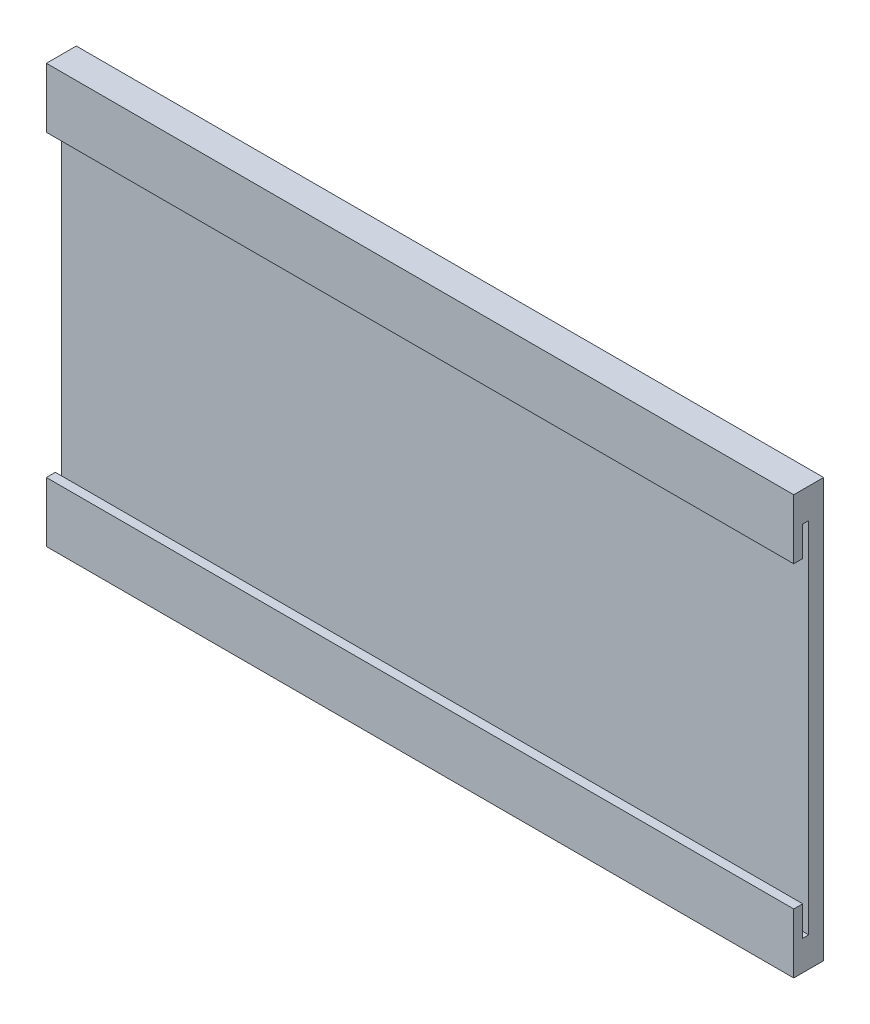
ISO-10303-21;
HEADER;
FILE_DESCRIPTION(('STEP AP214'),'2;1');
FILE_NAME('part.step','',(''),(''),'','','');
FILE_SCHEMA(('AUTOMOTIVE_DESIGN { 1 0 10303 214 1 1 1 1 }'));
ENDSEC;
DATA;
#1=APPLICATION_CONTEXT('core data for automotive mechanical design processes');
#2=APPLICATION_PROTOCOL_DEFINITION('international standard','automotive_design',2000,#1);
#3=PRODUCT_CONTEXT('',#1,'mechanical');
#4=PRODUCT('Part','Part','',(#3));
#5=PRODUCT_RELATED_PRODUCT_CATEGORY('part','',(#4));
#6=PRODUCT_DEFINITION_FORMATION('','',#4);
#7=PRODUCT_DEFINITION_CONTEXT('part definition',#1,'design');
#8=PRODUCT_DEFINITION('design','',#6,#7);
#9=PRODUCT_DEFINITION_SHAPE('','',#8);
#10=(LENGTH_UNIT() NAMED_UNIT(*) SI_UNIT(.MILLI.,.METRE.));
#11=(NAMED_UNIT(*) PLANE_ANGLE_UNIT() SI_UNIT($,.RADIAN.));
#12=(NAMED_UNIT(*) SI_UNIT($,.STERADIAN.) SOLID_ANGLE_UNIT());
#13=UNCERTAINTY_MEASURE_WITH_UNIT(LENGTH_MEASURE(1.E-05),#10,'distance_accuracy_value','');
#14=(GEOMETRIC_REPRESENTATION_CONTEXT(3) GLOBAL_UNCERTAINTY_ASSIGNED_CONTEXT((#13)) GLOBAL_UNIT_ASSIGNED_CONTEXT((#10,
#11,#12)) REPRESENTATION_CONTEXT('',''));
#15=CARTESIAN_POINT('',(0.,0.,0.));
#16=DIRECTION('',(0.,0.,1.));
#17=DIRECTION('',(1.,0.,0.));
#18=AXIS2_PLACEMENT_3D('',#15,#16,#17);
#19=CARTESIAN_POINT('',(0.,0.,5.));
#20=DIRECTION('',(0.,0.,1.));
#21=DIRECTION('',(1.,0.,0.));
#22=AXIS2_PLACEMENT_3D('',#19,#20,#21);
#23=PLANE('',#22);
#24=DIRECTION('',(0.,-1.,0.));
#25=VECTOR('',#24,1.);
#26=CARTESIAN_POINT('',(250.,0.,5.));
#27=LINE('',#26,#25);
#28=CARTESIAN_POINT('',(250.,-50.,5.));
#29=VERTEX_POINT('',#28);
#30=CARTESIAN_POINT('',(250.,-70.,5.));
#31=VERTEX_POINT('',#30);
#32=EDGE_CURVE('E270',#29,#31,#27,.T.);
#33=ORIENTED_EDGE('',*,*,#32,.F.);
#34=DIRECTION('',(1.,0.,0.));
#35=VECTOR('',#34,1.);
#36=CARTESIAN_POINT('',(0.,-50.,5.));
#37=LINE('',#36,#35);
#38=CARTESIAN_POINT('',(0.,-50.,5.));
#39=VERTEX_POINT('',#38);
#40=EDGE_CURVE('E284',#39,#29,#37,.T.);
#41=ORIENTED_EDGE('',*,*,#40,.F.);
#42=DIRECTION('',(0.,-1.,0.));
#43=VECTOR('',#42,1.);
#44=CARTESIAN_POINT('',(0.,0.,5.));
#45=LINE('',#44,#43);
#46=CARTESIAN_POINT('',(0.,-70.,5.));
#47=VERTEX_POINT('',#46);
#48=EDGE_CURVE('E264',#39,#47,#45,.T.);
#49=ORIENTED_EDGE('',*,*,#48,.T.);
#50=DIRECTION('',(1.,0.,0.));
#51=VECTOR('',#50,1.);
#52=CARTESIAN_POINT('',(0.,-70.,5.));
#53=LINE('',#52,#51);
#54=EDGE_CURVE('E267',#47,#31,#53,.T.);
#55=ORIENTED_EDGE('',*,*,#54,.T.);
#56=EDGE_LOOP('',(#33,#41,#49,#55));
#57=FACE_BOUND('',#56,.T.);
#58=ADVANCED_FACE('F131',(#57),#23,.T.);
#59=DIRECTION('',(1.,0.,0.));
#60=VECTOR('',#59,1.);
#61=CARTESIAN_POINT('',(0.,50.,5.));
#62=LINE('',#61,#60);
#63=CARTESIAN_POINT('',(0.,50.,5.));
#64=VERTEX_POINT('',#63);
#65=CARTESIAN_POINT('',(250.,50.,5.));
#66=VERTEX_POINT('',#65);
#67=EDGE_CURVE('E243',#64,#66,#62,.T.);
#68=ORIENTED_EDGE('',*,*,#67,.T.);
#69=CARTESIAN_POINT('',(250.,70.,5.));
#70=VERTEX_POINT('',#69);
#71=EDGE_CURVE('E271',#70,#66,#27,.T.);
#72=ORIENTED_EDGE('',*,*,#71,.F.);
#73=DIRECTION('',(1.,0.,0.));
#74=VECTOR('',#73,1.);
#75=CARTESIAN_POINT('',(0.,70.,5.));
#76=LINE('',#75,#74);
#77=CARTESIAN_POINT('',(0.,70.,5.));
#78=VERTEX_POINT('',#77);
#79=EDGE_CURVE('E255',#78,#70,#76,.T.);
#80=ORIENTED_EDGE('',*,*,#79,.F.);
#81=EDGE_CURVE('E265',#78,#64,#45,.T.);
#82=ORIENTED_EDGE('',*,*,#81,.T.);
#83=EDGE_LOOP('',(#68,#72,#80,#82));
#84=FACE_BOUND('',#83,.T.);
#85=ADVANCED_FACE('F335',(#84),#23,.T.);
#86=CARTESIAN_POINT('',(0.,70.,5.));
#87=DIRECTION('',(0.,1.,0.));
#88=DIRECTION('',(-1.,0.,0.));
#89=AXIS2_PLACEMENT_3D('',#86,#87,#88);
#90=PLANE('',#89);
#91=DIRECTION('',(0.,0.,-1.));
#92=VECTOR('',#91,1.);
#93=CARTESIAN_POINT('',(250.,70.,5.));
#94=LINE('',#93,#92);
#95=CARTESIAN_POINT('',(250.,70.,-5.));
#96=VERTEX_POINT('',#95);
#97=EDGE_CURVE('E261',#70,#96,#94,.T.);
#98=ORIENTED_EDGE('',*,*,#97,.T.);
#99=DIRECTION('',(1.,0.,0.));
#100=VECTOR('',#99,1.);
#101=CARTESIAN_POINT('',(0.,70.,-5.));
#102=LINE('',#101,#100);
#103=CARTESIAN_POINT('',(0.,70.,-5.));
#104=VERTEX_POINT('',#103);
#105=EDGE_CURVE('E247',#104,#96,#102,.T.);
#106=ORIENTED_EDGE('',*,*,#105,.F.);
#107=DIRECTION('',(0.,0.,-1.));
#108=VECTOR('',#107,1.);
#109=CARTESIAN_POINT('',(0.,70.,5.));
#110=LINE('',#109,#108);
#111=EDGE_CURVE('E258',#78,#104,#110,.T.);
#112=ORIENTED_EDGE('',*,*,#111,.F.);
#113=ORIENTED_EDGE('',*,*,#79,.T.);
#114=EDGE_LOOP('',(#98,#106,#112,#113));
#115=FACE_BOUND('',#114,.T.);
#116=ADVANCED_FACE('F340',(#115),#90,.T.);
#117=CARTESIAN_POINT('',(250.,0.,-5.));
#118=DIRECTION('',(-1.,0.,0.));
#119=DIRECTION('',(0.,0.,1.));
#120=AXIS2_PLACEMENT_3D('',#117,#118,#119);
#121=PLANE('',#120);
#122=DIRECTION('',(0.,0.,-1.));
#123=VECTOR('',#122,1.);
#124=CARTESIAN_POINT('',(250.,50.,5.));
#125=LINE('',#124,#123);
#126=CARTESIAN_POINT('',(250.,50.,2.));
#127=VERTEX_POINT('',#126);
#128=EDGE_CURVE('E244',#66,#127,#125,.T.);
#129=ORIENTED_EDGE('',*,*,#128,.T.);
#130=DIRECTION('',(0.,-1.,0.));
#131=VECTOR('',#130,1.);
#132=CARTESIAN_POINT('',(250.,0.,2.));
#133=LINE('',#132,#131);
#134=CARTESIAN_POINT('',(250.,60.,2.));
#135=VERTEX_POINT('',#134);
#136=EDGE_CURVE('E227',#135,#127,#133,.T.);
#137=ORIENTED_EDGE('',*,*,#136,.F.);
#138=DIRECTION('',(0.,0.,-1.));
#139=VECTOR('',#138,1.);
#140=CARTESIAN_POINT('',(250.,60.,2.));
#141=LINE('',#140,#139);
#142=CARTESIAN_POINT('',(250.,60.,0.));
#143=VERTEX_POINT('',#142);
#144=EDGE_CURVE('E295',#135,#143,#141,.T.);
#145=ORIENTED_EDGE('',*,*,#144,.T.);
#146=DIRECTION('',(0.,-1.,0.));
#147=VECTOR('',#146,1.);
#148=CARTESIAN_POINT('',(250.,0.,0.));
#149=LINE('',#148,#147);
#150=CARTESIAN_POINT('',(250.,-60.,0.));
#151=VERTEX_POINT('',#150);
#152=EDGE_CURVE('E293',#143,#151,#149,.T.);
#153=ORIENTED_EDGE('',*,*,#152,.T.);
#154=DIRECTION('',(0.,0.,-1.));
#155=VECTOR('',#154,1.);
#156=CARTESIAN_POINT('',(250.,-60.,2.));
#157=LINE('',#156,#155);
#158=CARTESIAN_POINT('',(250.,-60.,2.));
#159=VERTEX_POINT('',#158);
#160=EDGE_CURVE('E310',#159,#151,#157,.T.);
#161=ORIENTED_EDGE('',*,*,#160,.F.);
#162=DIRECTION('',(0.,-1.,0.));
#163=VECTOR('',#162,1.);
#164=CARTESIAN_POINT('',(250.,0.,2.));
#165=LINE('',#164,#163);
#166=CARTESIAN_POINT('',(250.,-50.,2.));
#167=VERTEX_POINT('',#166);
#168=EDGE_CURVE('E316',#167,#159,#165,.T.);
#169=ORIENTED_EDGE('',*,*,#168,.F.);
#170=DIRECTION('',(0.,0.,-1.));
#171=VECTOR('',#170,1.);
#172=CARTESIAN_POINT('',(250.,-50.,5.));
#173=LINE('',#172,#171);
#174=EDGE_CURVE('E250',#29,#167,#173,.T.);
#175=ORIENTED_EDGE('',*,*,#174,.F.);
#176=ORIENTED_EDGE('',*,*,#32,.T.);
#177=DIRECTION('',(0.,0.,1.));
#178=VECTOR('',#177,1.);
#179=CARTESIAN_POINT('',(250.,-70.,-5.));
#180=LINE('',#179,#178);
#181=CARTESIAN_POINT('',(250.,-70.,-5.));
#182=VERTEX_POINT('',#181);
#183=EDGE_CURVE('E12',#182,#31,#180,.T.);
#184=ORIENTED_EDGE('',*,*,#183,.F.);
#185=DIRECTION('',(0.,-1.,0.));
#186=VECTOR('',#185,1.);
#187=CARTESIAN_POINT('',(250.,0.,-5.));
#188=LINE('',#187,#186);
#189=EDGE_CURVE('E146',#96,#182,#188,.T.);
#190=ORIENTED_EDGE('',*,*,#189,.F.);
#191=ORIENTED_EDGE('',*,*,#97,.F.);
#192=ORIENTED_EDGE('',*,*,#71,.T.);
#193=EDGE_LOOP('',(#129,#137,#145,#153,#161,#169,#175,#176,#184,#190,#191,#192));
#194=FACE_BOUND('',#193,.T.);
#195=ADVANCED_FACE('F332',(#194),#121,.F.);
#196=CARTESIAN_POINT('',(0.,-70.,-5.));
#197=DIRECTION('',(0.,-1.,0.));
#198=DIRECTION('',(1.,0.,0.));
#199=AXIS2_PLACEMENT_3D('',#196,#197,#198);
#200=PLANE('',#199);
#201=ORIENTED_EDGE('',*,*,#183,.T.);
#202=ORIENTED_EDGE('',*,*,#54,.F.);
#203=DIRECTION('',(0.,0.,1.));
#204=VECTOR('',#203,1.);
#205=CARTESIAN_POINT('',(0.,-70.,-5.));
#206=LINE('',#205,#204);
#207=CARTESIAN_POINT('',(0.,-70.,-5.));
#208=VERTEX_POINT('',#207);
#209=EDGE_CURVE('E135',#208,#47,#206,.T.);
#210=ORIENTED_EDGE('',*,*,#209,.F.);
#211=DIRECTION('',(1.,0.,0.));
#212=VECTOR('',#211,1.);
#213=CARTESIAN_POINT('',(0.,-70.,-5.));
#214=LINE('',#213,#212);
#215=EDGE_CURVE('E277',#208,#182,#214,.T.);
#216=ORIENTED_EDGE('',*,*,#215,.T.);
#217=EDGE_LOOP('',(#201,#202,#210,#216));
#218=FACE_BOUND('',#217,.T.);
#219=ADVANCED_FACE('F280',(#218),#200,.T.);
#220=CARTESIAN_POINT('',(0.,0.,-5.));
#221=DIRECTION('',(-1.,0.,0.));
#222=DIRECTION('',(0.,0.,1.));
#223=AXIS2_PLACEMENT_3D('',#220,#221,#222);
#224=PLANE('',#223);
#225=DIRECTION('',(0.,-1.,0.));
#226=VECTOR('',#225,1.);
#227=CARTESIAN_POINT('',(0.,0.,2.));
#228=LINE('',#227,#226);
#229=CARTESIAN_POINT('',(0.,60.,2.));
#230=VERTEX_POINT('',#229);
#231=CARTESIAN_POINT('',(0.,50.,2.));
#232=VERTEX_POINT('',#231);
#233=EDGE_CURVE('E224',#230,#232,#228,.T.);
#234=ORIENTED_EDGE('',*,*,#233,.T.);
#235=DIRECTION('',(0.,0.,-1.));
#236=VECTOR('',#235,1.);
#237=CARTESIAN_POINT('',(0.,50.,5.));
#238=LINE('',#237,#236);
#239=EDGE_CURVE('E235',#64,#232,#238,.T.);
#240=ORIENTED_EDGE('',*,*,#239,.F.);
#241=ORIENTED_EDGE('',*,*,#81,.F.);
#242=ORIENTED_EDGE('',*,*,#111,.T.);
#243=DIRECTION('',(0.,-1.,0.));
#244=VECTOR('',#243,1.);
#245=CARTESIAN_POINT('',(0.,0.,-5.));
#246=LINE('',#245,#244);
#247=EDGE_CURVE('E274',#104,#208,#246,.T.);
#248=ORIENTED_EDGE('',*,*,#247,.T.);
#249=ORIENTED_EDGE('',*,*,#209,.T.);
#250=ORIENTED_EDGE('',*,*,#48,.F.);
#251=DIRECTION('',(0.,0.,-1.));
#252=VECTOR('',#251,1.);
#253=CARTESIAN_POINT('',(0.,-50.,5.));
#254=LINE('',#253,#252);
#255=CARTESIAN_POINT('',(0.,-50.,2.));
#256=VERTEX_POINT('',#255);
#257=EDGE_CURVE('E245',#39,#256,#254,.T.);
#258=ORIENTED_EDGE('',*,*,#257,.T.);
#259=DIRECTION('',(0.,-1.,0.));
#260=VECTOR('',#259,1.);
#261=CARTESIAN_POINT('',(0.,0.,2.));
#262=LINE('',#261,#260);
#263=CARTESIAN_POINT('',(0.,-60.,2.));
#264=VERTEX_POINT('',#263);
#265=EDGE_CURVE('E314',#256,#264,#262,.T.);
#266=ORIENTED_EDGE('',*,*,#265,.T.);
#267=DIRECTION('',(0.,0.,-1.));
#268=VECTOR('',#267,1.);
#269=CARTESIAN_POINT('',(0.,-60.,2.));
#270=LINE('',#269,#268);
#271=CARTESIAN_POINT('',(0.,-60.,0.));
#272=VERTEX_POINT('',#271);
#273=EDGE_CURVE('E307',#264,#272,#270,.T.);
#274=ORIENTED_EDGE('',*,*,#273,.T.);
#275=DIRECTION('',(0.,-1.,0.));
#276=VECTOR('',#275,1.);
#277=CARTESIAN_POINT('',(0.,0.,0.));
#278=LINE('',#277,#276);
#279=CARTESIAN_POINT('',(0.,60.,0.));
#280=VERTEX_POINT('',#279);
#281=EDGE_CURVE('E289',#280,#272,#278,.T.);
#282=ORIENTED_EDGE('',*,*,#281,.F.);
#283=DIRECTION('',(0.,0.,-1.));
#284=VECTOR('',#283,1.);
#285=CARTESIAN_POINT('',(0.,60.,2.));
#286=LINE('',#285,#284);
#287=EDGE_CURVE('E238',#230,#280,#286,.T.);
#288=ORIENTED_EDGE('',*,*,#287,.F.);
#289=EDGE_LOOP('',(#234,#240,#241,#242,#248,#249,#250,#258,#266,#274,#282,#288));
#290=FACE_BOUND('',#289,.T.);
#291=ADVANCED_FACE('F133',(#290),#224,.T.);
#292=CARTESIAN_POINT('',(0.,0.,-5.));
#293=DIRECTION('',(0.,0.,1.));
#294=DIRECTION('',(1.,0.,0.));
#295=AXIS2_PLACEMENT_3D('',#292,#293,#294);
#296=PLANE('',#295);
#297=ORIENTED_EDGE('',*,*,#247,.F.);
#298=ORIENTED_EDGE('',*,*,#105,.T.);
#299=ORIENTED_EDGE('',*,*,#189,.T.);
#300=ORIENTED_EDGE('',*,*,#215,.F.);
#301=EDGE_LOOP('',(#297,#298,#299,#300));
#302=FACE_BOUND('',#301,.T.);
#303=ADVANCED_FACE('F341',(#302),#296,.F.);
#304=CARTESIAN_POINT('',(0.,50.,5.));
#305=DIRECTION('',(0.,1.,0.));
#306=DIRECTION('',(0.,0.,1.));
#307=AXIS2_PLACEMENT_3D('',#304,#305,#306);
#308=PLANE('',#307);
#309=ORIENTED_EDGE('',*,*,#239,.T.);
#310=DIRECTION('',(1.,0.,0.));
#311=VECTOR('',#310,1.);
#312=CARTESIAN_POINT('',(0.,50.,2.));
#313=LINE('',#312,#311);
#314=EDGE_CURVE('E220',#232,#127,#313,.T.);
#315=ORIENTED_EDGE('',*,*,#314,.T.);
#316=ORIENTED_EDGE('',*,*,#128,.F.);
#317=ORIENTED_EDGE('',*,*,#67,.F.);
#318=EDGE_LOOP('',(#309,#315,#316,#317));
#319=FACE_BOUND('',#318,.T.);
#320=ADVANCED_FACE('F241',(#319),#308,.F.);
#321=CARTESIAN_POINT('',(0.,-50.,5.));
#322=DIRECTION('',(0.,1.,0.));
#323=DIRECTION('',(0.,0.,1.));
#324=AXIS2_PLACEMENT_3D('',#321,#322,#323);
#325=PLANE('',#324);
#326=DIRECTION('',(1.,0.,0.));
#327=VECTOR('',#326,1.);
#328=CARTESIAN_POINT('',(0.,-50.,2.));
#329=LINE('',#328,#327);
#330=EDGE_CURVE('E311',#256,#167,#329,.T.);
#331=ORIENTED_EDGE('',*,*,#330,.F.);
#332=ORIENTED_EDGE('',*,*,#257,.F.);
#333=ORIENTED_EDGE('',*,*,#40,.T.);
#334=ORIENTED_EDGE('',*,*,#174,.T.);
#335=EDGE_LOOP('',(#331,#332,#333,#334));
#336=FACE_BOUND('',#335,.T.);
#337=ADVANCED_FACE('F348',(#336),#325,.T.);
#338=CARTESIAN_POINT('',(0.,0.,0.));
#339=DIRECTION('',(0.,0.,1.));
#340=DIRECTION('',(1.,0.,0.));
#341=AXIS2_PLACEMENT_3D('',#338,#339,#340);
#342=PLANE('',#341);
#343=ORIENTED_EDGE('',*,*,#152,.F.);
#344=DIRECTION('',(1.,0.,0.));
#345=VECTOR('',#344,1.);
#346=CARTESIAN_POINT('',(0.,60.,0.));
#347=LINE('',#346,#345);
#348=EDGE_CURVE('E239',#280,#143,#347,.T.);
#349=ORIENTED_EDGE('',*,*,#348,.F.);
#350=ORIENTED_EDGE('',*,*,#281,.T.);
#351=DIRECTION('',(1.,0.,0.));
#352=VECTOR('',#351,1.);
#353=CARTESIAN_POINT('',(0.,-60.,0.));
#354=LINE('',#353,#352);
#355=EDGE_CURVE('E301',#272,#151,#354,.T.);
#356=ORIENTED_EDGE('',*,*,#355,.T.);
#357=EDGE_LOOP('',(#343,#349,#350,#356));
#358=FACE_BOUND('',#357,.T.);
#359=ADVANCED_FACE('F300',(#358),#342,.T.);
#360=CARTESIAN_POINT('',(0.,-60.,2.));
#361=DIRECTION('',(0.,1.,0.));
#362=DIRECTION('',(-1.,0.,0.));
#363=AXIS2_PLACEMENT_3D('',#360,#361,#362);
#364=PLANE('',#363);
#365=ORIENTED_EDGE('',*,*,#355,.F.);
#366=ORIENTED_EDGE('',*,*,#273,.F.);
#367=DIRECTION('',(1.,0.,0.));
#368=VECTOR('',#367,1.);
#369=CARTESIAN_POINT('',(0.,-60.,2.));
#370=LINE('',#369,#368);
#371=EDGE_CURVE('E321',#264,#159,#370,.T.);
#372=ORIENTED_EDGE('',*,*,#371,.T.);
#373=ORIENTED_EDGE('',*,*,#160,.T.);
#374=EDGE_LOOP('',(#365,#366,#372,#373));
#375=FACE_BOUND('',#374,.T.);
#376=ADVANCED_FACE('F306',(#375),#364,.T.);
#377=CARTESIAN_POINT('',(0.,0.,2.));
#378=DIRECTION('',(0.,0.,1.));
#379=DIRECTION('',(1.,0.,0.));
#380=AXIS2_PLACEMENT_3D('',#377,#378,#379);
#381=PLANE('',#380);
#382=ORIENTED_EDGE('',*,*,#330,.T.);
#383=ORIENTED_EDGE('',*,*,#168,.T.);
#384=ORIENTED_EDGE('',*,*,#371,.F.);
#385=ORIENTED_EDGE('',*,*,#265,.F.);
#386=EDGE_LOOP('',(#382,#383,#384,#385));
#387=FACE_BOUND('',#386,.T.);
#388=ADVANCED_FACE('F365',(#387),#381,.F.);
#389=CARTESIAN_POINT('',(0.,60.,2.));
#390=DIRECTION('',(0.,1.,0.));
#391=DIRECTION('',(0.,0.,1.));
#392=AXIS2_PLACEMENT_3D('',#389,#390,#391);
#393=PLANE('',#392);
#394=ORIENTED_EDGE('',*,*,#348,.T.);
#395=ORIENTED_EDGE('',*,*,#144,.F.);
#396=DIRECTION('',(1.,0.,0.));
#397=VECTOR('',#396,1.);
#398=CARTESIAN_POINT('',(0.,60.,2.));
#399=LINE('',#398,#397);
#400=EDGE_CURVE('E327',#230,#135,#399,.T.);
#401=ORIENTED_EDGE('',*,*,#400,.F.);
#402=ORIENTED_EDGE('',*,*,#287,.T.);
#403=EDGE_LOOP('',(#394,#395,#401,#402));
#404=FACE_BOUND('',#403,.T.);
#405=ADVANCED_FACE('F368',(#404),#393,.F.);
#406=CARTESIAN_POINT('',(0.,0.,2.));
#407=DIRECTION('',(0.,0.,1.));
#408=DIRECTION('',(1.,0.,0.));
#409=AXIS2_PLACEMENT_3D('',#406,#407,#408);
#410=PLANE('',#409);
#411=ORIENTED_EDGE('',*,*,#233,.F.);
#412=ORIENTED_EDGE('',*,*,#400,.T.);
#413=ORIENTED_EDGE('',*,*,#136,.T.);
#414=ORIENTED_EDGE('',*,*,#314,.F.);
#415=EDGE_LOOP('',(#411,#412,#413,#414));
#416=FACE_BOUND('',#415,.T.);
#417=ADVANCED_FACE('F222',(#416),#410,.F.);
#418=CLOSED_SHELL('',(#58,#85,#116,#195,#219,#291,#303,#320,#337,#359,#376,#388,#405,#417));
#419=MANIFOLD_SOLID_BREP('B2',#418);
#420=ADVANCED_BREP_SHAPE_REPRESENTATION('',(#18,#419),#14);
#421=SHAPE_DEFINITION_REPRESENTATION(#9,#420);
ENDSEC;
END-ISO-10303-21;
